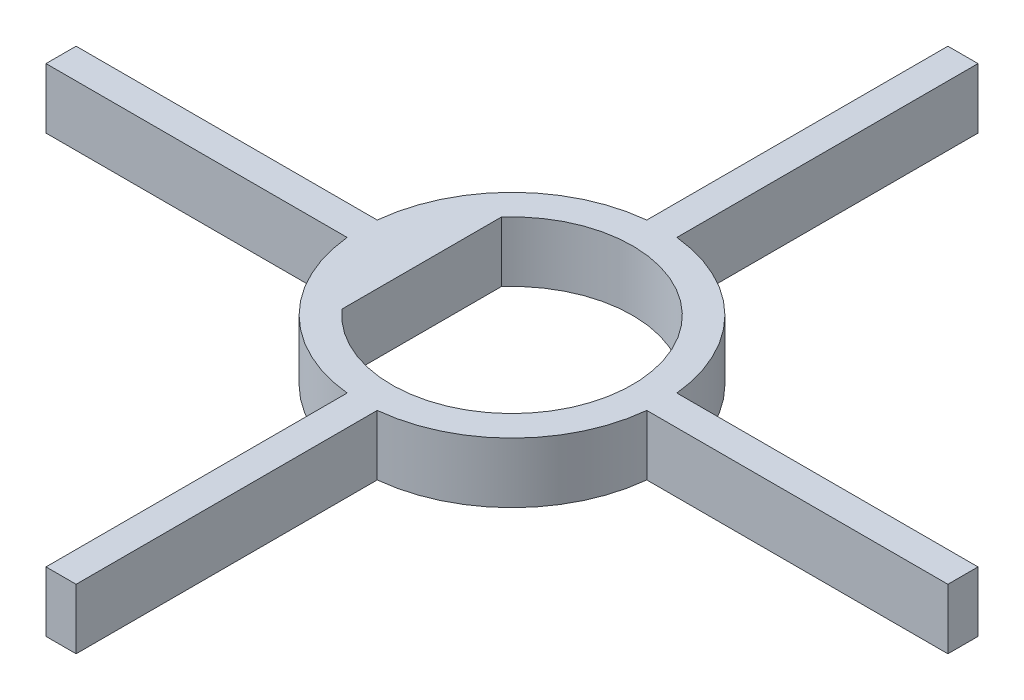
ISO-10303-21;
HEADER;
FILE_DESCRIPTION(('STEP AP214'),'2;1');
FILE_NAME('part.step','',(''),(''),'','','');
FILE_SCHEMA(('AUTOMOTIVE_DESIGN { 1 0 10303 214 1 1 1 1 }'));
ENDSEC;
DATA;
#1=APPLICATION_CONTEXT('core data for automotive mechanical design processes');
#2=APPLICATION_PROTOCOL_DEFINITION('international standard','automotive_design',2000,#1);
#3=PRODUCT_CONTEXT('',#1,'mechanical');
#4=PRODUCT('Part','Part','',(#3));
#5=PRODUCT_RELATED_PRODUCT_CATEGORY('part','',(#4));
#6=PRODUCT_DEFINITION_FORMATION('','',#4);
#7=PRODUCT_DEFINITION_CONTEXT('part definition',#1,'design');
#8=PRODUCT_DEFINITION('design','',#6,#7);
#9=PRODUCT_DEFINITION_SHAPE('','',#8);
#10=(LENGTH_UNIT() NAMED_UNIT(*) SI_UNIT(.MILLI.,.METRE.));
#11=(NAMED_UNIT(*) PLANE_ANGLE_UNIT() SI_UNIT($,.RADIAN.));
#12=(NAMED_UNIT(*) SI_UNIT($,.STERADIAN.) SOLID_ANGLE_UNIT());
#13=UNCERTAINTY_MEASURE_WITH_UNIT(LENGTH_MEASURE(1.E-05),#10,'distance_accuracy_value','');
#14=(GEOMETRIC_REPRESENTATION_CONTEXT(3) GLOBAL_UNCERTAINTY_ASSIGNED_CONTEXT((#13)) GLOBAL_UNIT_ASSIGNED_CONTEXT((#10,
#11,#12)) REPRESENTATION_CONTEXT('',''));
#15=CARTESIAN_POINT('',(0.,0.,0.));
#16=DIRECTION('',(0.,0.,1.));
#17=DIRECTION('',(1.,0.,0.));
#18=AXIS2_PLACEMENT_3D('',#15,#16,#17);
#19=CARTESIAN_POINT('',(0.,2.,0.));
#20=DIRECTION('',(0.,1.,0.));
#21=DIRECTION('',(0.,0.,1.));
#22=AXIS2_PLACEMENT_3D('',#19,#20,#21);
#23=PLANE('',#22);
#24=CARTESIAN_POINT('',(0.,2.,0.));
#25=DIRECTION('',(0.,1.,0.));
#26=DIRECTION('',(0.,0.,1.));
#27=AXIS2_PLACEMENT_3D('',#24,#25,#26);
#28=CIRCLE('',#27,5.);
#29=CARTESIAN_POINT('',(-0.500000000000001,2.,-4.9749371855331));
#30=VERTEX_POINT('',#29);
#31=CARTESIAN_POINT('',(-4.97493718553309,2.,-0.500000000000053));
#32=VERTEX_POINT('',#31);
#33=EDGE_CURVE('E181',#30,#32,#28,.T.);
#34=ORIENTED_EDGE('',*,*,#33,.T.);
#35=DIRECTION('',(-1.,0.,0.));
#36=VECTOR('',#35,1.);
#37=CARTESIAN_POINT('',(-14.9749371855331,2.,-0.500000000000157));
#38=LINE('',#37,#36);
#39=CARTESIAN_POINT('',(-14.9749371855331,2.,-0.500000000000157));
#40=VERTEX_POINT('',#39);
#41=EDGE_CURVE('E315',#32,#40,#38,.T.);
#42=ORIENTED_EDGE('',*,*,#41,.T.);
#43=DIRECTION('',(0.,0.,1.));
#44=VECTOR('',#43,1.);
#45=CARTESIAN_POINT('',(-14.9749371855331,2.,0.499999999999843));
#46=LINE('',#45,#44);
#47=CARTESIAN_POINT('',(-14.9749371855331,2.,0.499999999999843));
#48=VERTEX_POINT('',#47);
#49=EDGE_CURVE('E318',#40,#48,#46,.T.);
#50=ORIENTED_EDGE('',*,*,#49,.T.);
#51=DIRECTION('',(1.,0.,0.));
#52=VECTOR('',#51,1.);
#53=CARTESIAN_POINT('',(-4.97493718553311,2.,0.499999999999949));
#54=LINE('',#53,#52);
#55=CARTESIAN_POINT('',(-4.97493718553311,2.,0.499999999999946));
#56=VERTEX_POINT('',#55);
#57=EDGE_CURVE('E321',#48,#56,#54,.T.);
#58=ORIENTED_EDGE('',*,*,#57,.T.);
#59=CARTESIAN_POINT('',(0.,2.,0.));
#60=DIRECTION('',(0.,1.,0.));
#61=DIRECTION('',(0.,0.,1.));
#62=AXIS2_PLACEMENT_3D('',#59,#60,#61);
#63=CIRCLE('',#62,5.);
#64=CARTESIAN_POINT('',(-0.500000000000036,2.,4.9749371855331));
#65=VERTEX_POINT('',#64);
#66=EDGE_CURVE('E324',#56,#65,#63,.T.);
#67=ORIENTED_EDGE('',*,*,#66,.T.);
#68=DIRECTION('',(0.,0.,1.));
#69=VECTOR('',#68,1.);
#70=CARTESIAN_POINT('',(-0.499999999999719,2.,14.9749371855331));
#71=LINE('',#70,#69);
#72=CARTESIAN_POINT('',(-0.499999999999719,2.,14.9749371855331));
#73=VERTEX_POINT('',#72);
#74=EDGE_CURVE('E327',#65,#73,#71,.T.);
#75=ORIENTED_EDGE('',*,*,#74,.T.);
#76=DIRECTION('',(1.,0.,0.));
#77=VECTOR('',#76,1.);
#78=CARTESIAN_POINT('',(0.500000000000281,2.,14.9749371855331));
#79=LINE('',#78,#77);
#80=CARTESIAN_POINT('',(0.500000000000281,2.,14.9749371855331));
#81=VERTEX_POINT('',#80);
#82=EDGE_CURVE('E330',#73,#81,#79,.T.);
#83=ORIENTED_EDGE('',*,*,#82,.T.);
#84=DIRECTION('',(0.,0.,-1.));
#85=VECTOR('',#84,1.);
#86=CARTESIAN_POINT('',(0.499999999999967,2.,4.9749371855331));
#87=LINE('',#86,#85);
#88=CARTESIAN_POINT('',(0.499999999999967,2.,4.9749371855331));
#89=VERTEX_POINT('',#88);
#90=EDGE_CURVE('E333',#81,#89,#87,.T.);
#91=ORIENTED_EDGE('',*,*,#90,.T.);
#92=CARTESIAN_POINT('',(0.,2.,0.));
#93=DIRECTION('',(0.,1.,0.));
#94=DIRECTION('',(0.,0.,1.));
#95=AXIS2_PLACEMENT_3D('',#92,#93,#94);
#96=CIRCLE('',#95,5.);
#97=CARTESIAN_POINT('',(4.9749371855331,2.,0.500000000000019));
#98=VERTEX_POINT('',#97);
#99=EDGE_CURVE('E336',#89,#98,#96,.T.);
#100=ORIENTED_EDGE('',*,*,#99,.T.);
#101=DIRECTION('',(1.,0.,0.));
#102=VECTOR('',#101,1.);
#103=CARTESIAN_POINT('',(14.9749371855331,2.,0.500000000000052));
#104=LINE('',#103,#102);
#105=CARTESIAN_POINT('',(14.9749371855331,2.,0.500000000000052));
#106=VERTEX_POINT('',#105);
#107=EDGE_CURVE('E339',#98,#106,#104,.T.);
#108=ORIENTED_EDGE('',*,*,#107,.T.);
#109=DIRECTION('',(0.,0.,-1.));
#110=VECTOR('',#109,1.);
#111=CARTESIAN_POINT('',(14.9749371855331,2.,-0.499999999999948));
#112=LINE('',#111,#110);
#113=CARTESIAN_POINT('',(14.9749371855331,2.,-0.499999999999948));
#114=VERTEX_POINT('',#113);
#115=EDGE_CURVE('E342',#106,#114,#112,.T.);
#116=ORIENTED_EDGE('',*,*,#115,.T.);
#117=DIRECTION('',(-1.,0.,0.));
#118=VECTOR('',#117,1.);
#119=CARTESIAN_POINT('',(4.9749371855331,2.,-0.499999999999984));
#120=LINE('',#119,#118);
#121=CARTESIAN_POINT('',(4.9749371855331,2.,-0.499999999999984));
#122=VERTEX_POINT('',#121);
#123=EDGE_CURVE('E345',#114,#122,#120,.T.);
#124=ORIENTED_EDGE('',*,*,#123,.T.);
#125=CARTESIAN_POINT('',(0.,2.,0.));
#126=DIRECTION('',(0.,1.,0.));
#127=DIRECTION('',(0.,0.,1.));
#128=AXIS2_PLACEMENT_3D('',#125,#126,#127);
#129=CIRCLE('',#128,5.);
#130=CARTESIAN_POINT('',(0.500000000000001,2.,-4.9749371855331));
#131=VERTEX_POINT('',#130);
#132=EDGE_CURVE('E348',#122,#131,#129,.T.);
#133=ORIENTED_EDGE('',*,*,#132,.T.);
#134=DIRECTION('',(0.,0.,-1.));
#135=VECTOR('',#134,1.);
#136=CARTESIAN_POINT('',(0.5,2.,-14.9749371855331));
#137=LINE('',#136,#135);
#138=CARTESIAN_POINT('',(0.5,2.,-14.9749371855331));
#139=VERTEX_POINT('',#138);
#140=EDGE_CURVE('E351',#131,#139,#137,.T.);
#141=ORIENTED_EDGE('',*,*,#140,.T.);
#142=DIRECTION('',(-1.,0.,0.));
#143=VECTOR('',#142,1.);
#144=CARTESIAN_POINT('',(-0.5,2.,-14.9749371855331));
#145=LINE('',#144,#143);
#146=CARTESIAN_POINT('',(-0.5,2.,-14.9749371855331));
#147=VERTEX_POINT('',#146);
#148=EDGE_CURVE('E353',#139,#147,#145,.T.);
#149=ORIENTED_EDGE('',*,*,#148,.T.);
#150=DIRECTION('',(0.,0.,1.));
#151=VECTOR('',#150,1.);
#152=CARTESIAN_POINT('',(-0.500000000000001,2.,-4.9749371855331));
#153=LINE('',#152,#151);
#154=EDGE_CURVE('E189',#147,#30,#153,.T.);
#155=ORIENTED_EDGE('',*,*,#154,.T.);
#156=EDGE_LOOP('',(#34,#42,#50,#58,#67,#75,#83,#91,#100,#108,#116,#124,#133,#141,#149,#155));
#157=FACE_BOUND('',#156,.T.);
#158=DIRECTION('',(0.,0.,-1.));
#159=VECTOR('',#158,1.);
#160=CARTESIAN_POINT('',(-3.,2.,2.64575131106459));
#161=LINE('',#160,#159);
#162=CARTESIAN_POINT('',(-3.,2.,2.64575131106459));
#163=VERTEX_POINT('',#162);
#164=CARTESIAN_POINT('',(-3.,2.,-2.64575131106459));
#165=VERTEX_POINT('',#164);
#166=EDGE_CURVE('E306',#163,#165,#161,.T.);
#167=ORIENTED_EDGE('',*,*,#166,.T.);
#168=CARTESIAN_POINT('',(0.,2.,0.));
#169=DIRECTION('',(0.,1.,0.));
#170=DIRECTION('',(0.,0.,1.));
#171=AXIS2_PLACEMENT_3D('',#168,#169,#170);
#172=CIRCLE('',#171,4.);
#173=EDGE_CURVE('E302',#163,#165,#172,.T.);
#174=ORIENTED_EDGE('',*,*,#173,.F.);
#175=EDGE_LOOP('',(#167,#174));
#176=FACE_BOUND('',#175,.T.);
#177=ADVANCED_FACE('F39',(#157,#176),#23,.T.);
#178=CARTESIAN_POINT('',(0.,0.,0.));
#179=DIRECTION('',(0.,1.,0.));
#180=DIRECTION('',(0.,0.,1.));
#181=AXIS2_PLACEMENT_3D('',#178,#179,#180);
#182=PLANE('',#181);
#183=CARTESIAN_POINT('',(0.,0.,0.));
#184=DIRECTION('',(0.,1.,0.));
#185=DIRECTION('',(0.,0.,1.));
#186=AXIS2_PLACEMENT_3D('',#183,#184,#185);
#187=CIRCLE('',#186,5.);
#188=CARTESIAN_POINT('',(-0.500000000000001,0.,-4.9749371855331));
#189=VERTEX_POINT('',#188);
#190=CARTESIAN_POINT('',(-4.97493718553309,0.,-0.500000000000053));
#191=VERTEX_POINT('',#190);
#192=EDGE_CURVE('E186',#189,#191,#187,.T.);
#193=ORIENTED_EDGE('',*,*,#192,.F.);
#194=DIRECTION('',(0.,0.,1.));
#195=VECTOR('',#194,1.);
#196=CARTESIAN_POINT('',(-0.500000000000001,0.,-4.9749371855331));
#197=LINE('',#196,#195);
#198=CARTESIAN_POINT('',(-0.5,0.,-14.9749371855331));
#199=VERTEX_POINT('',#198);
#200=EDGE_CURVE('E171',#199,#189,#197,.T.);
#201=ORIENTED_EDGE('',*,*,#200,.F.);
#202=DIRECTION('',(-1.,0.,0.));
#203=VECTOR('',#202,1.);
#204=CARTESIAN_POINT('',(-0.5,0.,-14.9749371855331));
#205=LINE('',#204,#203);
#206=CARTESIAN_POINT('',(0.5,0.,-14.9749371855331));
#207=VERTEX_POINT('',#206);
#208=EDGE_CURVE('E165',#207,#199,#205,.T.);
#209=ORIENTED_EDGE('',*,*,#208,.F.);
#210=DIRECTION('',(0.,0.,-1.));
#211=VECTOR('',#210,1.);
#212=CARTESIAN_POINT('',(0.5,0.,-14.9749371855331));
#213=LINE('',#212,#211);
#214=CARTESIAN_POINT('',(0.500000000000001,0.,-4.9749371855331));
#215=VERTEX_POINT('',#214);
#216=EDGE_CURVE('E238',#215,#207,#213,.T.);
#217=ORIENTED_EDGE('',*,*,#216,.F.);
#218=CARTESIAN_POINT('',(0.,0.,0.));
#219=DIRECTION('',(0.,1.,0.));
#220=DIRECTION('',(0.,0.,1.));
#221=AXIS2_PLACEMENT_3D('',#218,#219,#220);
#222=CIRCLE('',#221,5.);
#223=CARTESIAN_POINT('',(4.9749371855331,0.,-0.499999999999984));
#224=VERTEX_POINT('',#223);
#225=EDGE_CURVE('E235',#224,#215,#222,.T.);
#226=ORIENTED_EDGE('',*,*,#225,.F.);
#227=DIRECTION('',(-1.,0.,0.));
#228=VECTOR('',#227,1.);
#229=CARTESIAN_POINT('',(4.9749371855331,0.,-0.499999999999984));
#230=LINE('',#229,#228);
#231=CARTESIAN_POINT('',(14.9749371855331,0.,-0.499999999999948));
#232=VERTEX_POINT('',#231);
#233=EDGE_CURVE('E232',#232,#224,#230,.T.);
#234=ORIENTED_EDGE('',*,*,#233,.F.);
#235=DIRECTION('',(0.,0.,-1.));
#236=VECTOR('',#235,1.);
#237=CARTESIAN_POINT('',(14.9749371855331,0.,-0.499999999999948));
#238=LINE('',#237,#236);
#239=CARTESIAN_POINT('',(14.9749371855331,0.,0.500000000000052));
#240=VERTEX_POINT('',#239);
#241=EDGE_CURVE('E229',#240,#232,#238,.T.);
#242=ORIENTED_EDGE('',*,*,#241,.F.);
#243=DIRECTION('',(1.,0.,0.));
#244=VECTOR('',#243,1.);
#245=CARTESIAN_POINT('',(14.9749371855331,0.,0.500000000000052));
#246=LINE('',#245,#244);
#247=CARTESIAN_POINT('',(4.9749371855331,0.,0.500000000000019));
#248=VERTEX_POINT('',#247);
#249=EDGE_CURVE('E226',#248,#240,#246,.T.);
#250=ORIENTED_EDGE('',*,*,#249,.F.);
#251=CARTESIAN_POINT('',(0.,0.,0.));
#252=DIRECTION('',(0.,1.,0.));
#253=DIRECTION('',(0.,0.,1.));
#254=AXIS2_PLACEMENT_3D('',#251,#252,#253);
#255=CIRCLE('',#254,5.);
#256=CARTESIAN_POINT('',(0.499999999999967,0.,4.9749371855331));
#257=VERTEX_POINT('',#256);
#258=EDGE_CURVE('E223',#257,#248,#255,.T.);
#259=ORIENTED_EDGE('',*,*,#258,.F.);
#260=DIRECTION('',(0.,0.,-1.));
#261=VECTOR('',#260,1.);
#262=CARTESIAN_POINT('',(0.499999999999967,0.,4.9749371855331));
#263=LINE('',#262,#261);
#264=CARTESIAN_POINT('',(0.500000000000281,0.,14.9749371855331));
#265=VERTEX_POINT('',#264);
#266=EDGE_CURVE('E220',#265,#257,#263,.T.);
#267=ORIENTED_EDGE('',*,*,#266,.F.);
#268=DIRECTION('',(1.,0.,0.));
#269=VECTOR('',#268,1.);
#270=CARTESIAN_POINT('',(0.500000000000281,0.,14.9749371855331));
#271=LINE('',#270,#269);
#272=CARTESIAN_POINT('',(-0.499999999999719,0.,14.9749371855331));
#273=VERTEX_POINT('',#272);
#274=EDGE_CURVE('E217',#273,#265,#271,.T.);
#275=ORIENTED_EDGE('',*,*,#274,.F.);
#276=DIRECTION('',(0.,0.,1.));
#277=VECTOR('',#276,1.);
#278=CARTESIAN_POINT('',(-0.499999999999719,0.,14.9749371855331));
#279=LINE('',#278,#277);
#280=CARTESIAN_POINT('',(-0.500000000000036,0.,4.9749371855331));
#281=VERTEX_POINT('',#280);
#282=EDGE_CURVE('E214',#281,#273,#279,.T.);
#283=ORIENTED_EDGE('',*,*,#282,.F.);
#284=CARTESIAN_POINT('',(0.,0.,0.));
#285=DIRECTION('',(0.,1.,0.));
#286=DIRECTION('',(0.,0.,1.));
#287=AXIS2_PLACEMENT_3D('',#284,#285,#286);
#288=CIRCLE('',#287,5.);
#289=CARTESIAN_POINT('',(-4.97493718553311,0.,0.499999999999946));
#290=VERTEX_POINT('',#289);
#291=EDGE_CURVE('E211',#290,#281,#288,.T.);
#292=ORIENTED_EDGE('',*,*,#291,.F.);
#293=DIRECTION('',(1.,0.,0.));
#294=VECTOR('',#293,1.);
#295=CARTESIAN_POINT('',(-4.97493718553311,0.,0.499999999999949));
#296=LINE('',#295,#294);
#297=CARTESIAN_POINT('',(-14.9749371855331,0.,0.499999999999843));
#298=VERTEX_POINT('',#297);
#299=EDGE_CURVE('E208',#298,#290,#296,.T.);
#300=ORIENTED_EDGE('',*,*,#299,.F.);
#301=DIRECTION('',(0.,0.,1.));
#302=VECTOR('',#301,1.);
#303=CARTESIAN_POINT('',(-14.9749371855331,0.,0.499999999999843));
#304=LINE('',#303,#302);
#305=CARTESIAN_POINT('',(-14.9749371855331,0.,-0.500000000000157));
#306=VERTEX_POINT('',#305);
#307=EDGE_CURVE('E200',#306,#298,#304,.T.);
#308=ORIENTED_EDGE('',*,*,#307,.F.);
#309=DIRECTION('',(-1.,0.,0.));
#310=VECTOR('',#309,1.);
#311=CARTESIAN_POINT('',(-14.9749371855331,0.,-0.500000000000157));
#312=LINE('',#311,#310);
#313=EDGE_CURVE('E194',#191,#306,#312,.T.);
#314=ORIENTED_EDGE('',*,*,#313,.F.);
#315=EDGE_LOOP('',(#193,#201,#209,#217,#226,#234,#242,#250,#259,#267,#275,#283,#292,#300,#308,#314));
#316=FACE_BOUND('',#315,.T.);
#317=CARTESIAN_POINT('',(0.,0.,0.));
#318=DIRECTION('',(0.,-1.,0.));
#319=DIRECTION('',(0.,0.,-1.));
#320=AXIS2_PLACEMENT_3D('',#317,#318,#319);
#321=CIRCLE('',#320,4.);
#322=CARTESIAN_POINT('',(-3.,0.,-2.64575131106459));
#323=VERTEX_POINT('',#322);
#324=CARTESIAN_POINT('',(-3.,0.,2.64575131106459));
#325=VERTEX_POINT('',#324);
#326=EDGE_CURVE('E11',#323,#325,#321,.T.);
#327=ORIENTED_EDGE('',*,*,#326,.F.);
#328=DIRECTION('',(0.,0.,1.));
#329=VECTOR('',#328,1.);
#330=CARTESIAN_POINT('',(-3.,0.,0.));
#331=LINE('',#330,#329);
#332=EDGE_CURVE('E49',#323,#325,#331,.T.);
#333=ORIENTED_EDGE('',*,*,#332,.T.);
#334=EDGE_LOOP('',(#327,#333));
#335=FACE_BOUND('',#334,.T.);
#336=ADVANCED_FACE('F191',(#316,#335),#182,.F.);
#337=CARTESIAN_POINT('',(0.,2.,0.));
#338=DIRECTION('',(0.,-1.,0.));
#339=DIRECTION('',(0.,0.,-1.));
#340=AXIS2_PLACEMENT_3D('',#337,#338,#339);
#341=CYLINDRICAL_SURFACE('',#340,5.);
#342=ORIENTED_EDGE('',*,*,#192,.T.);
#343=DIRECTION('',(0.,-1.,0.));
#344=VECTOR('',#343,1.);
#345=CARTESIAN_POINT('',(-4.97493718553309,2.,-0.500000000000053));
#346=LINE('',#345,#344);
#347=EDGE_CURVE('E296',#32,#191,#346,.T.);
#348=ORIENTED_EDGE('',*,*,#347,.F.);
#349=ORIENTED_EDGE('',*,*,#33,.F.);
#350=DIRECTION('',(0.,-1.,0.));
#351=VECTOR('',#350,1.);
#352=CARTESIAN_POINT('',(-0.500000000000001,2.,-4.9749371855331));
#353=LINE('',#352,#351);
#354=EDGE_CURVE('E175',#30,#189,#353,.T.);
#355=ORIENTED_EDGE('',*,*,#354,.T.);
#356=EDGE_LOOP('',(#342,#348,#349,#355));
#357=FACE_BOUND('',#356,.T.);
#358=ADVANCED_FACE('F41',(#357),#341,.T.);
#359=CARTESIAN_POINT('',(-14.9749371855331,2.,-0.500000000000157));
#360=DIRECTION('',(0.,0.,1.));
#361=DIRECTION('',(1.,0.,0.));
#362=AXIS2_PLACEMENT_3D('',#359,#360,#361);
#363=PLANE('',#362);
#364=ORIENTED_EDGE('',*,*,#313,.T.);
#365=DIRECTION('',(0.,-1.,0.));
#366=VECTOR('',#365,1.);
#367=CARTESIAN_POINT('',(-14.9749371855331,2.,-0.500000000000157));
#368=LINE('',#367,#366);
#369=EDGE_CURVE('E292',#40,#306,#368,.T.);
#370=ORIENTED_EDGE('',*,*,#369,.F.);
#371=ORIENTED_EDGE('',*,*,#41,.F.);
#372=ORIENTED_EDGE('',*,*,#347,.T.);
#373=EDGE_LOOP('',(#364,#370,#371,#372));
#374=FACE_BOUND('',#373,.T.);
#375=ADVANCED_FACE('F360',(#374),#363,.F.);
#376=CARTESIAN_POINT('',(-14.9749371855331,2.,0.499999999999843));
#377=DIRECTION('',(1.,0.,0.));
#378=DIRECTION('',(0.,0.,-1.));
#379=AXIS2_PLACEMENT_3D('',#376,#377,#378);
#380=PLANE('',#379);
#381=ORIENTED_EDGE('',*,*,#307,.T.);
#382=DIRECTION('',(0.,-1.,0.));
#383=VECTOR('',#382,1.);
#384=CARTESIAN_POINT('',(-14.9749371855331,2.,0.499999999999843));
#385=LINE('',#384,#383);
#386=EDGE_CURVE('E288',#48,#298,#385,.T.);
#387=ORIENTED_EDGE('',*,*,#386,.F.);
#388=ORIENTED_EDGE('',*,*,#49,.F.);
#389=ORIENTED_EDGE('',*,*,#369,.T.);
#390=EDGE_LOOP('',(#381,#387,#388,#389));
#391=FACE_BOUND('',#390,.T.);
#392=ADVANCED_FACE('F364',(#391),#380,.F.);
#393=CARTESIAN_POINT('',(-4.97493718553311,2.,0.499999999999949));
#394=DIRECTION('',(0.,0.,-1.));
#395=DIRECTION('',(-1.,0.,0.));
#396=AXIS2_PLACEMENT_3D('',#393,#394,#395);
#397=PLANE('',#396);
#398=ORIENTED_EDGE('',*,*,#299,.T.);
#399=DIRECTION('',(0.,-1.,0.));
#400=VECTOR('',#399,1.);
#401=CARTESIAN_POINT('',(-4.97493718553311,2.,0.499999999999946));
#402=LINE('',#401,#400);
#403=EDGE_CURVE('E284',#56,#290,#402,.T.);
#404=ORIENTED_EDGE('',*,*,#403,.F.);
#405=ORIENTED_EDGE('',*,*,#57,.F.);
#406=ORIENTED_EDGE('',*,*,#386,.T.);
#407=EDGE_LOOP('',(#398,#404,#405,#406));
#408=FACE_BOUND('',#407,.T.);
#409=ADVANCED_FACE('F370',(#408),#397,.F.);
#410=CARTESIAN_POINT('',(0.,2.,0.));
#411=DIRECTION('',(0.,-1.,0.));
#412=DIRECTION('',(0.,0.,-1.));
#413=AXIS2_PLACEMENT_3D('',#410,#411,#412);
#414=CYLINDRICAL_SURFACE('',#413,5.);
#415=ORIENTED_EDGE('',*,*,#291,.T.);
#416=DIRECTION('',(0.,-1.,0.));
#417=VECTOR('',#416,1.);
#418=CARTESIAN_POINT('',(-0.500000000000036,2.,4.9749371855331));
#419=LINE('',#418,#417);
#420=EDGE_CURVE('E280',#65,#281,#419,.T.);
#421=ORIENTED_EDGE('',*,*,#420,.F.);
#422=ORIENTED_EDGE('',*,*,#66,.F.);
#423=ORIENTED_EDGE('',*,*,#403,.T.);
#424=EDGE_LOOP('',(#415,#421,#422,#423));
#425=FACE_BOUND('',#424,.T.);
#426=ADVANCED_FACE('F374',(#425),#414,.T.);
#427=CARTESIAN_POINT('',(-0.499999999999719,2.,14.9749371855331));
#428=DIRECTION('',(1.,0.,0.));
#429=DIRECTION('',(0.,0.,-1.));
#430=AXIS2_PLACEMENT_3D('',#427,#428,#429);
#431=PLANE('',#430);
#432=ORIENTED_EDGE('',*,*,#282,.T.);
#433=DIRECTION('',(0.,-1.,0.));
#434=VECTOR('',#433,1.);
#435=CARTESIAN_POINT('',(-0.499999999999719,2.,14.9749371855331));
#436=LINE('',#435,#434);
#437=EDGE_CURVE('E276',#73,#273,#436,.T.);
#438=ORIENTED_EDGE('',*,*,#437,.F.);
#439=ORIENTED_EDGE('',*,*,#74,.F.);
#440=ORIENTED_EDGE('',*,*,#420,.T.);
#441=EDGE_LOOP('',(#432,#438,#439,#440));
#442=FACE_BOUND('',#441,.T.);
#443=ADVANCED_FACE('F379',(#442),#431,.F.);
#444=CARTESIAN_POINT('',(0.500000000000281,2.,14.9749371855331));
#445=DIRECTION('',(0.,0.,-1.));
#446=DIRECTION('',(-1.,0.,0.));
#447=AXIS2_PLACEMENT_3D('',#444,#445,#446);
#448=PLANE('',#447);
#449=ORIENTED_EDGE('',*,*,#274,.T.);
#450=DIRECTION('',(0.,-1.,0.));
#451=VECTOR('',#450,1.);
#452=CARTESIAN_POINT('',(0.500000000000281,2.,14.9749371855331));
#453=LINE('',#452,#451);
#454=EDGE_CURVE('E272',#81,#265,#453,.T.);
#455=ORIENTED_EDGE('',*,*,#454,.F.);
#456=ORIENTED_EDGE('',*,*,#82,.F.);
#457=ORIENTED_EDGE('',*,*,#437,.T.);
#458=EDGE_LOOP('',(#449,#455,#456,#457));
#459=FACE_BOUND('',#458,.T.);
#460=ADVANCED_FACE('F385',(#459),#448,.F.);
#461=CARTESIAN_POINT('',(0.499999999999967,2.,4.9749371855331));
#462=DIRECTION('',(-1.,0.,0.));
#463=DIRECTION('',(0.,0.,1.));
#464=AXIS2_PLACEMENT_3D('',#461,#462,#463);
#465=PLANE('',#464);
#466=ORIENTED_EDGE('',*,*,#266,.T.);
#467=DIRECTION('',(0.,-1.,0.));
#468=VECTOR('',#467,1.);
#469=CARTESIAN_POINT('',(0.499999999999967,2.,4.9749371855331));
#470=LINE('',#469,#468);
#471=EDGE_CURVE('E268',#89,#257,#470,.T.);
#472=ORIENTED_EDGE('',*,*,#471,.F.);
#473=ORIENTED_EDGE('',*,*,#90,.F.);
#474=ORIENTED_EDGE('',*,*,#454,.T.);
#475=EDGE_LOOP('',(#466,#472,#473,#474));
#476=FACE_BOUND('',#475,.T.);
#477=ADVANCED_FACE('F389',(#476),#465,.F.);
#478=CARTESIAN_POINT('',(0.,2.,0.));
#479=DIRECTION('',(0.,-1.,0.));
#480=DIRECTION('',(0.,0.,-1.));
#481=AXIS2_PLACEMENT_3D('',#478,#479,#480);
#482=CYLINDRICAL_SURFACE('',#481,5.);
#483=ORIENTED_EDGE('',*,*,#258,.T.);
#484=DIRECTION('',(0.,-1.,0.));
#485=VECTOR('',#484,1.);
#486=CARTESIAN_POINT('',(4.9749371855331,2.,0.500000000000019));
#487=LINE('',#486,#485);
#488=EDGE_CURVE('E264',#98,#248,#487,.T.);
#489=ORIENTED_EDGE('',*,*,#488,.F.);
#490=ORIENTED_EDGE('',*,*,#99,.F.);
#491=ORIENTED_EDGE('',*,*,#471,.T.);
#492=EDGE_LOOP('',(#483,#489,#490,#491));
#493=FACE_BOUND('',#492,.T.);
#494=ADVANCED_FACE('F394',(#493),#482,.T.);
#495=CARTESIAN_POINT('',(14.9749371855331,2.,0.500000000000052));
#496=DIRECTION('',(0.,0.,-1.));
#497=DIRECTION('',(-1.,0.,0.));
#498=AXIS2_PLACEMENT_3D('',#495,#496,#497);
#499=PLANE('',#498);
#500=ORIENTED_EDGE('',*,*,#249,.T.);
#501=DIRECTION('',(0.,-1.,0.));
#502=VECTOR('',#501,1.);
#503=CARTESIAN_POINT('',(14.9749371855331,2.,0.500000000000052));
#504=LINE('',#503,#502);
#505=EDGE_CURVE('E260',#106,#240,#504,.T.);
#506=ORIENTED_EDGE('',*,*,#505,.F.);
#507=ORIENTED_EDGE('',*,*,#107,.F.);
#508=ORIENTED_EDGE('',*,*,#488,.T.);
#509=EDGE_LOOP('',(#500,#506,#507,#508));
#510=FACE_BOUND('',#509,.T.);
#511=ADVANCED_FACE('F400',(#510),#499,.F.);
#512=CARTESIAN_POINT('',(14.9749371855331,2.,-0.499999999999948));
#513=DIRECTION('',(-1.,0.,0.));
#514=DIRECTION('',(0.,0.,1.));
#515=AXIS2_PLACEMENT_3D('',#512,#513,#514);
#516=PLANE('',#515);
#517=ORIENTED_EDGE('',*,*,#241,.T.);
#518=DIRECTION('',(0.,-1.,0.));
#519=VECTOR('',#518,1.);
#520=CARTESIAN_POINT('',(14.9749371855331,2.,-0.499999999999948));
#521=LINE('',#520,#519);
#522=EDGE_CURVE('E256',#114,#232,#521,.T.);
#523=ORIENTED_EDGE('',*,*,#522,.F.);
#524=ORIENTED_EDGE('',*,*,#115,.F.);
#525=ORIENTED_EDGE('',*,*,#505,.T.);
#526=EDGE_LOOP('',(#517,#523,#524,#525));
#527=FACE_BOUND('',#526,.T.);
#528=ADVANCED_FACE('F404',(#527),#516,.F.);
#529=CARTESIAN_POINT('',(4.9749371855331,2.,-0.499999999999984));
#530=DIRECTION('',(0.,0.,1.));
#531=DIRECTION('',(1.,0.,0.));
#532=AXIS2_PLACEMENT_3D('',#529,#530,#531);
#533=PLANE('',#532);
#534=ORIENTED_EDGE('',*,*,#233,.T.);
#535=DIRECTION('',(0.,-1.,0.));
#536=VECTOR('',#535,1.);
#537=CARTESIAN_POINT('',(4.9749371855331,2.,-0.499999999999984));
#538=LINE('',#537,#536);
#539=EDGE_CURVE('E252',#122,#224,#538,.T.);
#540=ORIENTED_EDGE('',*,*,#539,.F.);
#541=ORIENTED_EDGE('',*,*,#123,.F.);
#542=ORIENTED_EDGE('',*,*,#522,.T.);
#543=EDGE_LOOP('',(#534,#540,#541,#542));
#544=FACE_BOUND('',#543,.T.);
#545=ADVANCED_FACE('F409',(#544),#533,.F.);
#546=CARTESIAN_POINT('',(0.,2.,0.));
#547=DIRECTION('',(0.,-1.,0.));
#548=DIRECTION('',(0.,0.,-1.));
#549=AXIS2_PLACEMENT_3D('',#546,#547,#548);
#550=CYLINDRICAL_SURFACE('',#549,5.);
#551=ORIENTED_EDGE('',*,*,#225,.T.);
#552=DIRECTION('',(0.,-1.,0.));
#553=VECTOR('',#552,1.);
#554=CARTESIAN_POINT('',(0.500000000000001,2.,-4.9749371855331));
#555=LINE('',#554,#553);
#556=EDGE_CURVE('E248',#131,#215,#555,.T.);
#557=ORIENTED_EDGE('',*,*,#556,.F.);
#558=ORIENTED_EDGE('',*,*,#132,.F.);
#559=ORIENTED_EDGE('',*,*,#539,.T.);
#560=EDGE_LOOP('',(#551,#557,#558,#559));
#561=FACE_BOUND('',#560,.T.);
#562=ADVANCED_FACE('F415',(#561),#550,.T.);
#563=CARTESIAN_POINT('',(0.5,2.,-14.9749371855331));
#564=DIRECTION('',(-1.,0.,0.));
#565=DIRECTION('',(0.,0.,1.));
#566=AXIS2_PLACEMENT_3D('',#563,#564,#565);
#567=PLANE('',#566);
#568=ORIENTED_EDGE('',*,*,#216,.T.);
#569=DIRECTION('',(0.,-1.,0.));
#570=VECTOR('',#569,1.);
#571=CARTESIAN_POINT('',(0.5,2.,-14.9749371855331));
#572=LINE('',#571,#570);
#573=EDGE_CURVE('E245',#139,#207,#572,.T.);
#574=ORIENTED_EDGE('',*,*,#573,.F.);
#575=ORIENTED_EDGE('',*,*,#140,.F.);
#576=ORIENTED_EDGE('',*,*,#556,.T.);
#577=EDGE_LOOP('',(#568,#574,#575,#576));
#578=FACE_BOUND('',#577,.T.);
#579=ADVANCED_FACE('F419',(#578),#567,.F.);
#580=CARTESIAN_POINT('',(-0.5,2.,-14.9749371855331));
#581=DIRECTION('',(0.,0.,1.));
#582=DIRECTION('',(1.,0.,0.));
#583=AXIS2_PLACEMENT_3D('',#580,#581,#582);
#584=PLANE('',#583);
#585=ORIENTED_EDGE('',*,*,#208,.T.);
#586=DIRECTION('',(0.,-1.,0.));
#587=VECTOR('',#586,1.);
#588=CARTESIAN_POINT('',(-0.5,2.,-14.9749371855331));
#589=LINE('',#588,#587);
#590=EDGE_CURVE('E177',#147,#199,#589,.T.);
#591=ORIENTED_EDGE('',*,*,#590,.F.);
#592=ORIENTED_EDGE('',*,*,#148,.F.);
#593=ORIENTED_EDGE('',*,*,#573,.T.);
#594=EDGE_LOOP('',(#585,#591,#592,#593));
#595=FACE_BOUND('',#594,.T.);
#596=ADVANCED_FACE('F420',(#595),#584,.F.);
#597=CARTESIAN_POINT('',(-0.500000000000001,2.,-4.9749371855331));
#598=DIRECTION('',(1.,0.,0.));
#599=DIRECTION('',(0.,0.,-1.));
#600=AXIS2_PLACEMENT_3D('',#597,#598,#599);
#601=PLANE('',#600);
#602=ORIENTED_EDGE('',*,*,#200,.T.);
#603=ORIENTED_EDGE('',*,*,#354,.F.);
#604=ORIENTED_EDGE('',*,*,#154,.F.);
#605=ORIENTED_EDGE('',*,*,#590,.T.);
#606=EDGE_LOOP('',(#602,#603,#604,#605));
#607=FACE_BOUND('',#606,.T.);
#608=ADVANCED_FACE('F173',(#607),#601,.F.);
#609=CARTESIAN_POINT('',(0.,2.,0.));
#610=DIRECTION('',(0.,-1.,0.));
#611=DIRECTION('',(0.,0.,-1.));
#612=AXIS2_PLACEMENT_3D('',#609,#610,#611);
#613=CYLINDRICAL_SURFACE('',#612,4.);
#614=ORIENTED_EDGE('',*,*,#326,.T.);
#615=DIRECTION('',(0.,-1.,0.));
#616=VECTOR('',#615,1.);
#617=CARTESIAN_POINT('',(-3.,2.,2.64575131106459));
#618=LINE('',#617,#616);
#619=EDGE_CURVE('E73',#163,#325,#618,.T.);
#620=ORIENTED_EDGE('',*,*,#619,.F.);
#621=ORIENTED_EDGE('',*,*,#173,.T.);
#622=DIRECTION('',(0.,-1.,0.));
#623=VECTOR('',#622,1.);
#624=CARTESIAN_POINT('',(-3.,2.,-2.64575131106459));
#625=LINE('',#624,#623);
#626=EDGE_CURVE('E56',#165,#323,#625,.T.);
#627=ORIENTED_EDGE('',*,*,#626,.T.);
#628=EDGE_LOOP('',(#614,#620,#621,#627));
#629=FACE_BOUND('',#628,.T.);
#630=ADVANCED_FACE('F300',(#629),#613,.F.);
#631=CARTESIAN_POINT('',(-3.,2.,2.64575131106459));
#632=DIRECTION('',(-1.,0.,0.));
#633=DIRECTION('',(0.,0.,1.));
#634=AXIS2_PLACEMENT_3D('',#631,#632,#633);
#635=PLANE('',#634);
#636=ORIENTED_EDGE('',*,*,#626,.F.);
#637=ORIENTED_EDGE('',*,*,#166,.F.);
#638=ORIENTED_EDGE('',*,*,#619,.T.);
#639=ORIENTED_EDGE('',*,*,#332,.F.);
#640=EDGE_LOOP('',(#636,#637,#638,#639));
#641=FACE_BOUND('',#640,.T.);
#642=ADVANCED_FACE('F438',(#641),#635,.F.);
#643=CLOSED_SHELL('',(#177,#336,#358,#375,#392,#409,#426,#443,#460,#477,#494,#511,#528,#545,
#562,#579,#596,#608,#630,#642));
#644=MANIFOLD_SOLID_BREP('B2',#643);
#645=ADVANCED_BREP_SHAPE_REPRESENTATION('',(#18,#644),#14);
#646=SHAPE_DEFINITION_REPRESENTATION(#9,#645);
ENDSEC;
END-ISO-10303-21;
